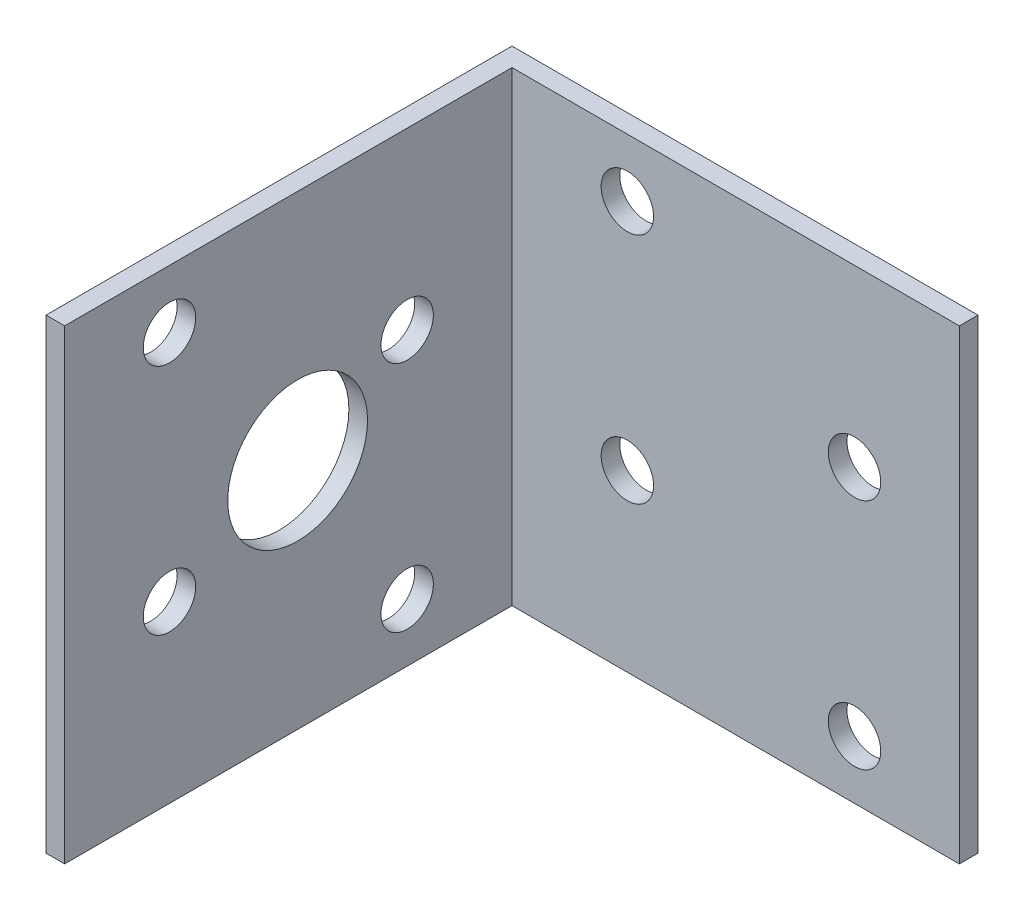
ISO-10303-21;
HEADER;
FILE_DESCRIPTION(('STEP AP214'),'2;1');
FILE_NAME('part.step','',(''),(''),'','','');
FILE_SCHEMA(('AUTOMOTIVE_DESIGN { 1 0 10303 214 1 1 1 1 }'));
ENDSEC;
DATA;
#1=APPLICATION_CONTEXT('core data for automotive mechanical design processes');
#2=APPLICATION_PROTOCOL_DEFINITION('international standard','automotive_design',2000,#1);
#3=PRODUCT_CONTEXT('',#1,'mechanical');
#4=PRODUCT('Part','Part','',(#3));
#5=PRODUCT_RELATED_PRODUCT_CATEGORY('part','',(#4));
#6=PRODUCT_DEFINITION_FORMATION('','',#4);
#7=PRODUCT_DEFINITION_CONTEXT('part definition',#1,'design');
#8=PRODUCT_DEFINITION('design','',#6,#7);
#9=PRODUCT_DEFINITION_SHAPE('','',#8);
#10=(LENGTH_UNIT() NAMED_UNIT(*) SI_UNIT(.MILLI.,.METRE.));
#11=(NAMED_UNIT(*) PLANE_ANGLE_UNIT() SI_UNIT($,.RADIAN.));
#12=(NAMED_UNIT(*) SI_UNIT($,.STERADIAN.) SOLID_ANGLE_UNIT());
#13=UNCERTAINTY_MEASURE_WITH_UNIT(LENGTH_MEASURE(1.E-05),#10,'distance_accuracy_value','');
#14=(GEOMETRIC_REPRESENTATION_CONTEXT(3) GLOBAL_UNCERTAINTY_ASSIGNED_CONTEXT((#13)) GLOBAL_UNIT_ASSIGNED_CONTEXT((#10,
#11,#12)) REPRESENTATION_CONTEXT('',''));
#15=CARTESIAN_POINT('',(0.,0.,0.));
#16=DIRECTION('',(0.,0.,1.));
#17=DIRECTION('',(1.,0.,0.));
#18=AXIS2_PLACEMENT_3D('',#15,#16,#17);
#19=CARTESIAN_POINT('',(0.,-40.,40.));
#20=DIRECTION('',(0.,-1.,0.));
#21=DIRECTION('',(0.,0.,-1.));
#22=AXIS2_PLACEMENT_3D('',#19,#20,#21);
#23=PLANE('',#22);
#24=DIRECTION('',(-1.,0.,0.));
#25=VECTOR('',#24,1.);
#26=CARTESIAN_POINT('',(40.,-40.,1.59999999999998));
#27=LINE('',#26,#25);
#28=CARTESIAN_POINT('',(40.,-40.,1.59999999999998));
#29=VERTEX_POINT('',#28);
#30=CARTESIAN_POINT('',(1.6,-40.,1.59999999999998));
#31=VERTEX_POINT('',#30);
#32=EDGE_CURVE('E49',#29,#31,#27,.T.);
#33=ORIENTED_EDGE('',*,*,#32,.T.);
#34=DIRECTION('',(0.,0.,1.));
#35=VECTOR('',#34,1.);
#36=CARTESIAN_POINT('',(1.6,-40.,1.59999999999998));
#37=LINE('',#36,#35);
#38=CARTESIAN_POINT('',(1.6,-40.,40.));
#39=VERTEX_POINT('',#38);
#40=EDGE_CURVE('E100',#31,#39,#37,.T.);
#41=ORIENTED_EDGE('',*,*,#40,.T.);
#42=DIRECTION('',(1.,0.,0.));
#43=VECTOR('',#42,1.);
#44=CARTESIAN_POINT('',(0.,-40.,40.));
#45=LINE('',#44,#43);
#46=CARTESIAN_POINT('',(0.,-40.,40.));
#47=VERTEX_POINT('',#46);
#48=EDGE_CURVE('E11',#47,#39,#45,.T.);
#49=ORIENTED_EDGE('',*,*,#48,.F.);
#50=DIRECTION('',(0.,0.,-1.));
#51=VECTOR('',#50,1.);
#52=CARTESIAN_POINT('',(0.,-40.,40.));
#53=LINE('',#52,#51);
#54=CARTESIAN_POINT('',(0.,-40.,0.));
#55=VERTEX_POINT('',#54);
#56=EDGE_CURVE('E118',#47,#55,#53,.T.);
#57=ORIENTED_EDGE('',*,*,#56,.T.);
#58=DIRECTION('',(1.,0.,0.));
#59=VECTOR('',#58,1.);
#60=CARTESIAN_POINT('',(0.,-40.,0.));
#61=LINE('',#60,#59);
#62=CARTESIAN_POINT('',(40.,-40.,0.));
#63=VERTEX_POINT('',#62);
#64=EDGE_CURVE('E36',#55,#63,#61,.T.);
#65=ORIENTED_EDGE('',*,*,#64,.T.);
#66=DIRECTION('',(0.,0.,-1.));
#67=VECTOR('',#66,1.);
#68=CARTESIAN_POINT('',(40.,-40.,40.));
#69=LINE('',#68,#67);
#70=EDGE_CURVE('E106',#29,#63,#69,.T.);
#71=ORIENTED_EDGE('',*,*,#70,.F.);
#72=EDGE_LOOP('',(#33,#41,#49,#57,#65,#71));
#73=FACE_BOUND('',#72,.T.);
#74=ADVANCED_FACE('F33',(#73),#23,.T.);
#75=CARTESIAN_POINT('',(0.,0.,40.));
#76=DIRECTION('',(0.,0.,1.));
#77=DIRECTION('',(0.,-1.,0.));
#78=AXIS2_PLACEMENT_3D('',#75,#76,#77);
#79=PLANE('',#78);
#80=DIRECTION('',(0.,1.,0.));
#81=VECTOR('',#80,1.);
#82=CARTESIAN_POINT('',(1.6,-40.,40.));
#83=LINE('',#82,#81);
#84=CARTESIAN_POINT('',(1.6,0.,40.));
#85=VERTEX_POINT('',#84);
#86=EDGE_CURVE('E99',#39,#85,#83,.T.);
#87=ORIENTED_EDGE('',*,*,#86,.T.);
#88=DIRECTION('',(1.,0.,0.));
#89=VECTOR('',#88,1.);
#90=CARTESIAN_POINT('',(0.,0.,40.));
#91=LINE('',#90,#89);
#92=CARTESIAN_POINT('',(0.,0.,40.));
#93=VERTEX_POINT('',#92);
#94=EDGE_CURVE('E41',#93,#85,#91,.T.);
#95=ORIENTED_EDGE('',*,*,#94,.F.);
#96=DIRECTION('',(0.,-1.,0.));
#97=VECTOR('',#96,1.);
#98=CARTESIAN_POINT('',(0.,0.,40.));
#99=LINE('',#98,#97);
#100=EDGE_CURVE('E126',#93,#47,#99,.T.);
#101=ORIENTED_EDGE('',*,*,#100,.T.);
#102=ORIENTED_EDGE('',*,*,#48,.T.);
#103=EDGE_LOOP('',(#87,#95,#101,#102));
#104=FACE_BOUND('',#103,.T.);
#105=ADVANCED_FACE('F142',(#104),#79,.T.);
#106=CARTESIAN_POINT('',(0.,0.,0.));
#107=DIRECTION('',(0.,1.,0.));
#108=DIRECTION('',(0.,0.,1.));
#109=AXIS2_PLACEMENT_3D('',#106,#107,#108);
#110=PLANE('',#109);
#111=DIRECTION('',(-1.,0.,0.));
#112=VECTOR('',#111,1.);
#113=CARTESIAN_POINT('',(40.,0.,1.6));
#114=LINE('',#113,#112);
#115=CARTESIAN_POINT('',(40.,0.,1.6));
#116=VERTEX_POINT('',#115);
#117=CARTESIAN_POINT('',(1.6,0.,1.6));
#118=VERTEX_POINT('',#117);
#119=EDGE_CURVE('E96',#116,#118,#114,.T.);
#120=ORIENTED_EDGE('',*,*,#119,.F.);
#121=DIRECTION('',(0.,0.,1.));
#122=VECTOR('',#121,1.);
#123=CARTESIAN_POINT('',(40.,0.,0.));
#124=LINE('',#123,#122);
#125=CARTESIAN_POINT('',(40.,0.,0.));
#126=VERTEX_POINT('',#125);
#127=EDGE_CURVE('E121',#126,#116,#124,.T.);
#128=ORIENTED_EDGE('',*,*,#127,.F.);
#129=DIRECTION('',(1.,0.,0.));
#130=VECTOR('',#129,1.);
#131=CARTESIAN_POINT('',(0.,0.,0.));
#132=LINE('',#131,#130);
#133=CARTESIAN_POINT('',(0.,0.,0.));
#134=VERTEX_POINT('',#133);
#135=EDGE_CURVE('E73',#134,#126,#132,.T.);
#136=ORIENTED_EDGE('',*,*,#135,.F.);
#137=DIRECTION('',(0.,0.,1.));
#138=VECTOR('',#137,1.);
#139=CARTESIAN_POINT('',(0.,0.,0.));
#140=LINE('',#139,#138);
#141=EDGE_CURVE('E123',#134,#93,#140,.T.);
#142=ORIENTED_EDGE('',*,*,#141,.T.);
#143=ORIENTED_EDGE('',*,*,#94,.T.);
#144=DIRECTION('',(0.,0.,1.));
#145=VECTOR('',#144,1.);
#146=CARTESIAN_POINT('',(1.6,0.,1.6));
#147=LINE('',#146,#145);
#148=EDGE_CURVE('E107',#118,#85,#147,.T.);
#149=ORIENTED_EDGE('',*,*,#148,.F.);
#150=EDGE_LOOP('',(#120,#128,#136,#142,#143,#149));
#151=FACE_BOUND('',#150,.T.);
#152=ADVANCED_FACE('F140',(#151),#110,.T.);
#153=CARTESIAN_POINT('',(0.,-40.,0.));
#154=DIRECTION('',(0.,0.,-1.));
#155=DIRECTION('',(0.,1.,0.));
#156=AXIS2_PLACEMENT_3D('',#153,#154,#155);
#157=PLANE('',#156);
#158=CARTESIAN_POINT('',(31.,-15.,0.));
#159=DIRECTION('',(0.,0.,1.));
#160=DIRECTION('',(1.,0.,0.));
#161=AXIS2_PLACEMENT_3D('',#158,#159,#160);
#162=CIRCLE('',#161,2.24999999999999);
#163=CARTESIAN_POINT('',(33.25,-15.,0.));
#164=VERTEX_POINT('',#163);
#165=EDGE_CURVE('E328',#164,#164,#162,.T.);
#166=ORIENTED_EDGE('',*,*,#165,.T.);
#167=EDGE_LOOP('',(#166));
#168=FACE_BOUND('',#167,.T.);
#169=CARTESIAN_POINT('',(11.5,-5.,0.));
#170=DIRECTION('',(0.,0.,1.));
#171=DIRECTION('',(1.,0.,0.));
#172=AXIS2_PLACEMENT_3D('',#169,#170,#171);
#173=CIRCLE('',#172,2.24999999999999);
#174=CARTESIAN_POINT('',(13.75,-5.,0.));
#175=VERTEX_POINT('',#174);
#176=EDGE_CURVE('E334',#175,#175,#173,.T.);
#177=ORIENTED_EDGE('',*,*,#176,.T.);
#178=EDGE_LOOP('',(#177));
#179=FACE_BOUND('',#178,.T.);
#180=CARTESIAN_POINT('',(11.5,-25.,0.));
#181=DIRECTION('',(0.,0.,1.));
#182=DIRECTION('',(1.,0.,0.));
#183=AXIS2_PLACEMENT_3D('',#180,#181,#182);
#184=CIRCLE('',#183,2.24999999999999);
#185=CARTESIAN_POINT('',(13.75,-25.,0.));
#186=VERTEX_POINT('',#185);
#187=EDGE_CURVE('E340',#186,#186,#184,.T.);
#188=ORIENTED_EDGE('',*,*,#187,.T.);
#189=EDGE_LOOP('',(#188));
#190=FACE_BOUND('',#189,.T.);
#191=CARTESIAN_POINT('',(31.,-35.,0.));
#192=DIRECTION('',(0.,0.,1.));
#193=DIRECTION('',(1.,0.,0.));
#194=AXIS2_PLACEMENT_3D('',#191,#192,#193);
#195=CIRCLE('',#194,2.24999999999999);
#196=CARTESIAN_POINT('',(33.25,-35.,0.));
#197=VERTEX_POINT('',#196);
#198=EDGE_CURVE('E111',#197,#197,#195,.T.);
#199=ORIENTED_EDGE('',*,*,#198,.T.);
#200=EDGE_LOOP('',(#199));
#201=FACE_BOUND('',#200,.T.);
#202=DIRECTION('',(0.,1.,0.));
#203=VECTOR('',#202,1.);
#204=CARTESIAN_POINT('',(40.,-40.,0.));
#205=LINE('',#204,#203);
#206=EDGE_CURVE('E130',#63,#126,#205,.T.);
#207=ORIENTED_EDGE('',*,*,#206,.F.);
#208=ORIENTED_EDGE('',*,*,#64,.F.);
#209=DIRECTION('',(0.,1.,0.));
#210=VECTOR('',#209,1.);
#211=CARTESIAN_POINT('',(0.,-40.,0.));
#212=LINE('',#211,#210);
#213=EDGE_CURVE('E120',#55,#134,#212,.T.);
#214=ORIENTED_EDGE('',*,*,#213,.T.);
#215=ORIENTED_EDGE('',*,*,#135,.T.);
#216=EDGE_LOOP('',(#207,#208,#214,#215));
#217=FACE_BOUND('',#216,.T.);
#218=ADVANCED_FACE('F136',(#168,#179,#190,#201,#217),#157,.T.);
#219=CARTESIAN_POINT('',(0.,0.,0.));
#220=DIRECTION('',(1.,0.,0.));
#221=DIRECTION('',(0.,0.,-1.));
#222=AXIS2_PLACEMENT_3D('',#219,#220,#221);
#223=PLANE('',#222);
#224=CARTESIAN_POINT('',(0.,-25.,31.));
#225=DIRECTION('',(1.,0.,0.));
#226=DIRECTION('',(0.,0.,-1.));
#227=AXIS2_PLACEMENT_3D('',#224,#225,#226);
#228=CIRCLE('',#227,2.24999999999999);
#229=CARTESIAN_POINT('',(0.,-25.,28.75));
#230=VERTEX_POINT('',#229);
#231=EDGE_CURVE('E294',#230,#230,#228,.T.);
#232=ORIENTED_EDGE('',*,*,#231,.T.);
#233=EDGE_LOOP('',(#232));
#234=FACE_BOUND('',#233,.T.);
#235=CARTESIAN_POINT('',(0.,-15.,10.6));
#236=DIRECTION('',(1.,0.,0.));
#237=DIRECTION('',(0.,0.,-1.));
#238=AXIS2_PLACEMENT_3D('',#235,#236,#237);
#239=CIRCLE('',#238,2.24999999999999);
#240=CARTESIAN_POINT('',(0.,-15.,8.35000000000001));
#241=VERTEX_POINT('',#240);
#242=EDGE_CURVE('E304',#241,#241,#239,.T.);
#243=ORIENTED_EDGE('',*,*,#242,.T.);
#244=EDGE_LOOP('',(#243));
#245=FACE_BOUND('',#244,.T.);
#246=CARTESIAN_POINT('',(0.,-35.,10.6));
#247=DIRECTION('',(1.,0.,0.));
#248=DIRECTION('',(0.,0.,-1.));
#249=AXIS2_PLACEMENT_3D('',#246,#247,#248);
#250=CIRCLE('',#249,2.24999999999999);
#251=CARTESIAN_POINT('',(0.,-35.,8.35000000000001));
#252=VERTEX_POINT('',#251);
#253=EDGE_CURVE('E310',#252,#252,#250,.T.);
#254=ORIENTED_EDGE('',*,*,#253,.T.);
#255=EDGE_LOOP('',(#254));
#256=FACE_BOUND('',#255,.T.);
#257=CARTESIAN_POINT('',(0.,-5.,31.));
#258=DIRECTION('',(1.,0.,0.));
#259=DIRECTION('',(0.,0.,-1.));
#260=AXIS2_PLACEMENT_3D('',#257,#258,#259);
#261=CIRCLE('',#260,2.24999999999999);
#262=CARTESIAN_POINT('',(0.,-5.,28.75));
#263=VERTEX_POINT('',#262);
#264=EDGE_CURVE('E316',#263,#263,#261,.T.);
#265=ORIENTED_EDGE('',*,*,#264,.T.);
#266=EDGE_LOOP('',(#265));
#267=FACE_BOUND('',#266,.T.);
#268=CARTESIAN_POINT('',(0.,-20.,20.));
#269=DIRECTION('',(1.,0.,0.));
#270=DIRECTION('',(0.,0.,-1.));
#271=AXIS2_PLACEMENT_3D('',#268,#269,#270);
#272=CIRCLE('',#271,5.99999999999999);
#273=CARTESIAN_POINT('',(0.,-20.,14.));
#274=VERTEX_POINT('',#273);
#275=EDGE_CURVE('E322',#274,#274,#272,.T.);
#276=ORIENTED_EDGE('',*,*,#275,.T.);
#277=EDGE_LOOP('',(#276));
#278=FACE_BOUND('',#277,.T.);
#279=ORIENTED_EDGE('',*,*,#56,.F.);
#280=ORIENTED_EDGE('',*,*,#100,.F.);
#281=ORIENTED_EDGE('',*,*,#141,.F.);
#282=ORIENTED_EDGE('',*,*,#213,.F.);
#283=EDGE_LOOP('',(#279,#280,#281,#282));
#284=FACE_BOUND('',#283,.T.);
#285=ADVANCED_FACE('F146',(#234,#245,#256,#267,#278,#284),#223,.F.);
#286=CARTESIAN_POINT('',(40.,0.,0.));
#287=DIRECTION('',(1.,0.,0.));
#288=DIRECTION('',(0.,0.,-1.));
#289=AXIS2_PLACEMENT_3D('',#286,#287,#288);
#290=PLANE('',#289);
#291=DIRECTION('',(0.,1.,0.));
#292=VECTOR('',#291,1.);
#293=CARTESIAN_POINT('',(40.,-40.,1.59999999999998));
#294=LINE('',#293,#292);
#295=EDGE_CURVE('E115',#29,#116,#294,.T.);
#296=ORIENTED_EDGE('',*,*,#295,.F.);
#297=ORIENTED_EDGE('',*,*,#70,.T.);
#298=ORIENTED_EDGE('',*,*,#206,.T.);
#299=ORIENTED_EDGE('',*,*,#127,.T.);
#300=EDGE_LOOP('',(#296,#297,#298,#299));
#301=FACE_BOUND('',#300,.T.);
#302=ADVANCED_FACE('F138',(#301),#290,.T.);
#303=CARTESIAN_POINT('',(40.,-40.,1.59999999999998));
#304=DIRECTION('',(0.,0.,-1.));
#305=DIRECTION('',(0.,1.,0.));
#306=AXIS2_PLACEMENT_3D('',#303,#304,#305);
#307=PLANE('',#306);
#308=CARTESIAN_POINT('',(31.,-15.,1.6));
#309=DIRECTION('',(0.,0.,1.));
#310=DIRECTION('',(1.,0.,0.));
#311=AXIS2_PLACEMENT_3D('',#308,#309,#310);
#312=CIRCLE('',#311,2.24999999999999);
#313=CARTESIAN_POINT('',(33.25,-15.,1.6));
#314=VERTEX_POINT('',#313);
#315=EDGE_CURVE('E325',#314,#314,#312,.T.);
#316=ORIENTED_EDGE('',*,*,#315,.F.);
#317=EDGE_LOOP('',(#316));
#318=FACE_BOUND('',#317,.T.);
#319=CARTESIAN_POINT('',(11.5,-5.,1.6));
#320=DIRECTION('',(0.,0.,1.));
#321=DIRECTION('',(1.,0.,0.));
#322=AXIS2_PLACEMENT_3D('',#319,#320,#321);
#323=CIRCLE('',#322,2.24999999999999);
#324=CARTESIAN_POINT('',(13.75,-5.,1.6));
#325=VERTEX_POINT('',#324);
#326=EDGE_CURVE('E331',#325,#325,#323,.T.);
#327=ORIENTED_EDGE('',*,*,#326,.F.);
#328=EDGE_LOOP('',(#327));
#329=FACE_BOUND('',#328,.T.);
#330=CARTESIAN_POINT('',(11.5,-25.,1.6));
#331=DIRECTION('',(0.,0.,1.));
#332=DIRECTION('',(1.,0.,0.));
#333=AXIS2_PLACEMENT_3D('',#330,#331,#332);
#334=CIRCLE('',#333,2.24999999999999);
#335=CARTESIAN_POINT('',(13.75,-25.,1.6));
#336=VERTEX_POINT('',#335);
#337=EDGE_CURVE('E337',#336,#336,#334,.T.);
#338=ORIENTED_EDGE('',*,*,#337,.F.);
#339=EDGE_LOOP('',(#338));
#340=FACE_BOUND('',#339,.T.);
#341=CARTESIAN_POINT('',(31.,-35.,1.6));
#342=DIRECTION('',(0.,0.,1.));
#343=DIRECTION('',(1.,0.,0.));
#344=AXIS2_PLACEMENT_3D('',#341,#342,#343);
#345=CIRCLE('',#344,2.24999999999999);
#346=CARTESIAN_POINT('',(33.25,-35.,1.6));
#347=VERTEX_POINT('',#346);
#348=EDGE_CURVE('E342',#347,#347,#345,.T.);
#349=ORIENTED_EDGE('',*,*,#348,.F.);
#350=EDGE_LOOP('',(#349));
#351=FACE_BOUND('',#350,.T.);
#352=ORIENTED_EDGE('',*,*,#119,.T.);
#353=DIRECTION('',(0.,1.,0.));
#354=VECTOR('',#353,1.);
#355=CARTESIAN_POINT('',(1.6,-40.,1.59999999999998));
#356=LINE('',#355,#354);
#357=EDGE_CURVE('E92',#31,#118,#356,.T.);
#358=ORIENTED_EDGE('',*,*,#357,.F.);
#359=ORIENTED_EDGE('',*,*,#32,.F.);
#360=ORIENTED_EDGE('',*,*,#295,.T.);
#361=EDGE_LOOP('',(#352,#358,#359,#360));
#362=FACE_BOUND('',#361,.T.);
#363=ADVANCED_FACE('F94',(#318,#329,#340,#351,#362),#307,.F.);
#364=CARTESIAN_POINT('',(1.6,-40.,1.59999999999998));
#365=DIRECTION('',(-1.,0.,0.));
#366=DIRECTION('',(0.,0.,1.));
#367=AXIS2_PLACEMENT_3D('',#364,#365,#366);
#368=PLANE('',#367);
#369=CARTESIAN_POINT('',(1.6,-25.,31.));
#370=DIRECTION('',(1.,0.,0.));
#371=DIRECTION('',(0.,0.,-1.));
#372=AXIS2_PLACEMENT_3D('',#369,#370,#371);
#373=CIRCLE('',#372,2.24999999999999);
#374=CARTESIAN_POINT('',(1.6,-25.,28.75));
#375=VERTEX_POINT('',#374);
#376=EDGE_CURVE('E297',#375,#375,#373,.T.);
#377=ORIENTED_EDGE('',*,*,#376,.F.);
#378=EDGE_LOOP('',(#377));
#379=FACE_BOUND('',#378,.T.);
#380=CARTESIAN_POINT('',(1.6,-15.,10.6));
#381=DIRECTION('',(1.,0.,0.));
#382=DIRECTION('',(0.,0.,-1.));
#383=AXIS2_PLACEMENT_3D('',#380,#381,#382);
#384=CIRCLE('',#383,2.24999999999999);
#385=CARTESIAN_POINT('',(1.6,-15.,8.35000000000001));
#386=VERTEX_POINT('',#385);
#387=EDGE_CURVE('E299',#386,#386,#384,.T.);
#388=ORIENTED_EDGE('',*,*,#387,.F.);
#389=EDGE_LOOP('',(#388));
#390=FACE_BOUND('',#389,.T.);
#391=CARTESIAN_POINT('',(1.6,-35.,10.6));
#392=DIRECTION('',(1.,0.,0.));
#393=DIRECTION('',(0.,0.,-1.));
#394=AXIS2_PLACEMENT_3D('',#391,#392,#393);
#395=CIRCLE('',#394,2.24999999999999);
#396=CARTESIAN_POINT('',(1.6,-35.,8.35000000000001));
#397=VERTEX_POINT('',#396);
#398=EDGE_CURVE('E307',#397,#397,#395,.T.);
#399=ORIENTED_EDGE('',*,*,#398,.F.);
#400=EDGE_LOOP('',(#399));
#401=FACE_BOUND('',#400,.T.);
#402=CARTESIAN_POINT('',(1.6,-5.,31.));
#403=DIRECTION('',(1.,0.,0.));
#404=DIRECTION('',(0.,0.,-1.));
#405=AXIS2_PLACEMENT_3D('',#402,#403,#404);
#406=CIRCLE('',#405,2.24999999999999);
#407=CARTESIAN_POINT('',(1.6,-5.,28.75));
#408=VERTEX_POINT('',#407);
#409=EDGE_CURVE('E313',#408,#408,#406,.T.);
#410=ORIENTED_EDGE('',*,*,#409,.F.);
#411=EDGE_LOOP('',(#410));
#412=FACE_BOUND('',#411,.T.);
#413=CARTESIAN_POINT('',(1.6,-20.,20.));
#414=DIRECTION('',(1.,0.,0.));
#415=DIRECTION('',(0.,0.,-1.));
#416=AXIS2_PLACEMENT_3D('',#413,#414,#415);
#417=CIRCLE('',#416,5.99999999999999);
#418=CARTESIAN_POINT('',(1.6,-20.,14.));
#419=VERTEX_POINT('',#418);
#420=EDGE_CURVE('E319',#419,#419,#417,.T.);
#421=ORIENTED_EDGE('',*,*,#420,.F.);
#422=EDGE_LOOP('',(#421));
#423=FACE_BOUND('',#422,.T.);
#424=ORIENTED_EDGE('',*,*,#148,.T.);
#425=ORIENTED_EDGE('',*,*,#86,.F.);
#426=ORIENTED_EDGE('',*,*,#40,.F.);
#427=ORIENTED_EDGE('',*,*,#357,.T.);
#428=EDGE_LOOP('',(#424,#425,#426,#427));
#429=FACE_BOUND('',#428,.T.);
#430=ADVANCED_FACE('F102',(#379,#390,#401,#412,#423,#429),#368,.F.);
#431=CARTESIAN_POINT('',(31.,-35.,1.6));
#432=DIRECTION('',(0.,0.,1.));
#433=DIRECTION('',(1.,0.,0.));
#434=AXIS2_PLACEMENT_3D('',#431,#432,#433);
#435=CYLINDRICAL_SURFACE('',#434,2.24999999999999);
#436=ORIENTED_EDGE('',*,*,#198,.F.);
#437=EDGE_LOOP('',(#436));
#438=FACE_BOUND('',#437,.T.);
#439=ORIENTED_EDGE('',*,*,#348,.T.);
#440=EDGE_LOOP('',(#439));
#441=FACE_BOUND('',#440,.T.);
#442=ADVANCED_FACE('F193',(#438,#441),#435,.F.);
#443=CARTESIAN_POINT('',(11.5,-25.,1.6));
#444=DIRECTION('',(0.,0.,1.));
#445=DIRECTION('',(1.,0.,0.));
#446=AXIS2_PLACEMENT_3D('',#443,#444,#445);
#447=CYLINDRICAL_SURFACE('',#446,2.24999999999999);
#448=ORIENTED_EDGE('',*,*,#187,.F.);
#449=EDGE_LOOP('',(#448));
#450=FACE_BOUND('',#449,.T.);
#451=ORIENTED_EDGE('',*,*,#337,.T.);
#452=EDGE_LOOP('',(#451));
#453=FACE_BOUND('',#452,.T.);
#454=ADVANCED_FACE('F198',(#450,#453),#447,.F.);
#455=CARTESIAN_POINT('',(11.5,-5.,1.6));
#456=DIRECTION('',(0.,0.,1.));
#457=DIRECTION('',(1.,0.,0.));
#458=AXIS2_PLACEMENT_3D('',#455,#456,#457);
#459=CYLINDRICAL_SURFACE('',#458,2.24999999999999);
#460=ORIENTED_EDGE('',*,*,#176,.F.);
#461=EDGE_LOOP('',(#460));
#462=FACE_BOUND('',#461,.T.);
#463=ORIENTED_EDGE('',*,*,#326,.T.);
#464=EDGE_LOOP('',(#463));
#465=FACE_BOUND('',#464,.T.);
#466=ADVANCED_FACE('F208',(#462,#465),#459,.F.);
#467=CARTESIAN_POINT('',(31.,-15.,1.6));
#468=DIRECTION('',(0.,0.,1.));
#469=DIRECTION('',(1.,0.,0.));
#470=AXIS2_PLACEMENT_3D('',#467,#468,#469);
#471=CYLINDRICAL_SURFACE('',#470,2.24999999999999);
#472=ORIENTED_EDGE('',*,*,#165,.F.);
#473=EDGE_LOOP('',(#472));
#474=FACE_BOUND('',#473,.T.);
#475=ORIENTED_EDGE('',*,*,#315,.T.);
#476=EDGE_LOOP('',(#475));
#477=FACE_BOUND('',#476,.T.);
#478=ADVANCED_FACE('F218',(#474,#477),#471,.F.);
#479=CARTESIAN_POINT('',(1.6,-20.,20.));
#480=DIRECTION('',(1.,0.,0.));
#481=DIRECTION('',(0.,0.,-1.));
#482=AXIS2_PLACEMENT_3D('',#479,#480,#481);
#483=CYLINDRICAL_SURFACE('',#482,5.99999999999999);
#484=ORIENTED_EDGE('',*,*,#275,.F.);
#485=EDGE_LOOP('',(#484));
#486=FACE_BOUND('',#485,.T.);
#487=ORIENTED_EDGE('',*,*,#420,.T.);
#488=EDGE_LOOP('',(#487));
#489=FACE_BOUND('',#488,.T.);
#490=ADVANCED_FACE('F228',(#486,#489),#483,.F.);
#491=CARTESIAN_POINT('',(1.6,-5.,31.));
#492=DIRECTION('',(1.,0.,0.));
#493=DIRECTION('',(0.,0.,-1.));
#494=AXIS2_PLACEMENT_3D('',#491,#492,#493);
#495=CYLINDRICAL_SURFACE('',#494,2.24999999999999);
#496=ORIENTED_EDGE('',*,*,#264,.F.);
#497=EDGE_LOOP('',(#496));
#498=FACE_BOUND('',#497,.T.);
#499=ORIENTED_EDGE('',*,*,#409,.T.);
#500=EDGE_LOOP('',(#499));
#501=FACE_BOUND('',#500,.T.);
#502=ADVANCED_FACE('F237',(#498,#501),#495,.F.);
#503=CARTESIAN_POINT('',(1.6,-35.,10.6));
#504=DIRECTION('',(1.,0.,0.));
#505=DIRECTION('',(0.,0.,-1.));
#506=AXIS2_PLACEMENT_3D('',#503,#504,#505);
#507=CYLINDRICAL_SURFACE('',#506,2.24999999999999);
#508=ORIENTED_EDGE('',*,*,#253,.F.);
#509=EDGE_LOOP('',(#508));
#510=FACE_BOUND('',#509,.T.);
#511=ORIENTED_EDGE('',*,*,#398,.T.);
#512=EDGE_LOOP('',(#511));
#513=FACE_BOUND('',#512,.T.);
#514=ADVANCED_FACE('F258',(#510,#513),#507,.F.);
#515=CARTESIAN_POINT('',(1.6,-15.,10.6));
#516=DIRECTION('',(1.,0.,0.));
#517=DIRECTION('',(0.,0.,-1.));
#518=AXIS2_PLACEMENT_3D('',#515,#516,#517);
#519=CYLINDRICAL_SURFACE('',#518,2.24999999999999);
#520=ORIENTED_EDGE('',*,*,#242,.F.);
#521=EDGE_LOOP('',(#520));
#522=FACE_BOUND('',#521,.T.);
#523=ORIENTED_EDGE('',*,*,#387,.T.);
#524=EDGE_LOOP('',(#523));
#525=FACE_BOUND('',#524,.T.);
#526=ADVANCED_FACE('F268',(#522,#525),#519,.F.);
#527=CARTESIAN_POINT('',(1.6,-25.,31.));
#528=DIRECTION('',(1.,0.,0.));
#529=DIRECTION('',(0.,0.,-1.));
#530=AXIS2_PLACEMENT_3D('',#527,#528,#529);
#531=CYLINDRICAL_SURFACE('',#530,2.24999999999999);
#532=ORIENTED_EDGE('',*,*,#231,.F.);
#533=EDGE_LOOP('',(#532));
#534=FACE_BOUND('',#533,.T.);
#535=ORIENTED_EDGE('',*,*,#376,.T.);
#536=EDGE_LOOP('',(#535));
#537=FACE_BOUND('',#536,.T.);
#538=ADVANCED_FACE('F278',(#534,#537),#531,.F.);
#539=CLOSED_SHELL('',(#74,#105,#152,#218,#285,#302,#363,#430,#442,#454,#466,#478,#490,#502,#514,
#526,#538));
#540=MANIFOLD_SOLID_BREP('B2',#539);
#541=ADVANCED_BREP_SHAPE_REPRESENTATION('',(#18,#540),#14);
#542=SHAPE_DEFINITION_REPRESENTATION(#9,#541);
ENDSEC;
END-ISO-10303-21;
